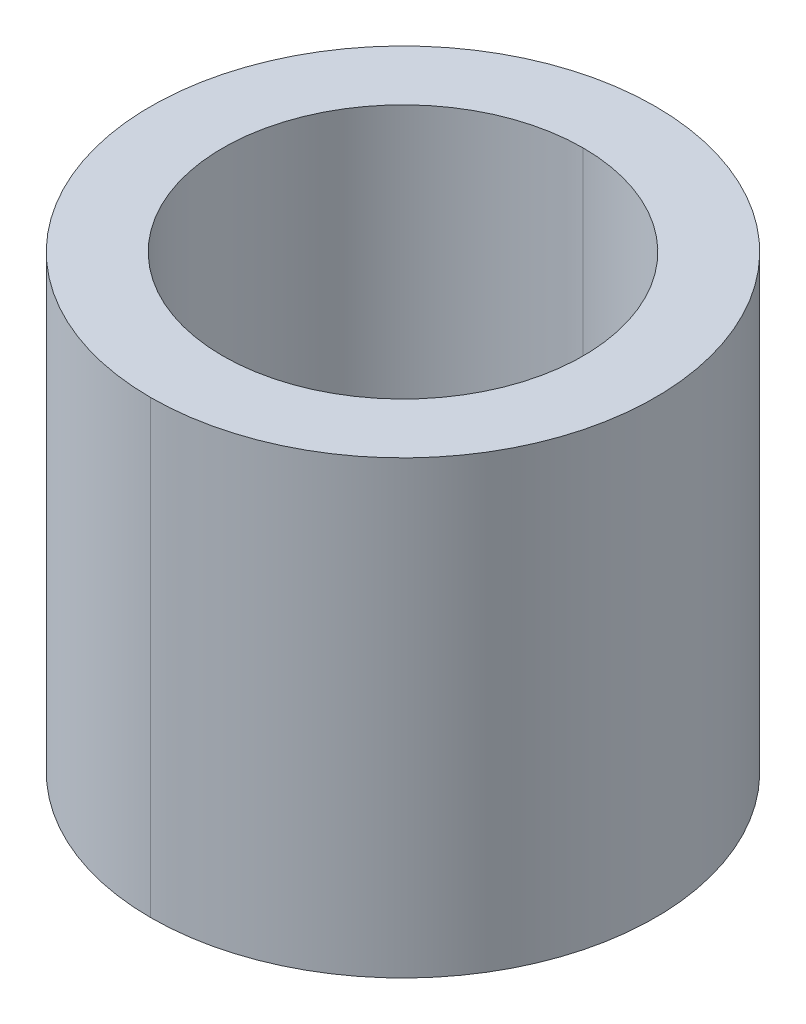
ISO-10303-21;
HEADER;
FILE_DESCRIPTION(('STEP AP214'),'2;1');
FILE_NAME('part.step','',(''),(''),'','','');
FILE_SCHEMA(('AUTOMOTIVE_DESIGN { 1 0 10303 214 1 1 1 1 }'));
ENDSEC;
DATA;
#1=APPLICATION_CONTEXT('core data for automotive mechanical design processes');
#2=APPLICATION_PROTOCOL_DEFINITION('international standard','automotive_design',2000,#1);
#3=PRODUCT_CONTEXT('',#1,'mechanical');
#4=PRODUCT('Part','Part','',(#3));
#5=PRODUCT_RELATED_PRODUCT_CATEGORY('part','',(#4));
#6=PRODUCT_DEFINITION_FORMATION('','',#4);
#7=PRODUCT_DEFINITION_CONTEXT('part definition',#1,'design');
#8=PRODUCT_DEFINITION('design','',#6,#7);
#9=PRODUCT_DEFINITION_SHAPE('','',#8);
#10=(LENGTH_UNIT() NAMED_UNIT(*) SI_UNIT(.MILLI.,.METRE.));
#11=(NAMED_UNIT(*) PLANE_ANGLE_UNIT() SI_UNIT($,.RADIAN.));
#12=(NAMED_UNIT(*) SI_UNIT($,.STERADIAN.) SOLID_ANGLE_UNIT());
#13=UNCERTAINTY_MEASURE_WITH_UNIT(LENGTH_MEASURE(1.E-05),#10,'distance_accuracy_value','');
#14=(GEOMETRIC_REPRESENTATION_CONTEXT(3) GLOBAL_UNCERTAINTY_ASSIGNED_CONTEXT((#13)) GLOBAL_UNIT_ASSIGNED_CONTEXT((#10,
#11,#12)) REPRESENTATION_CONTEXT('',''));
#15=CARTESIAN_POINT('',(0.,0.,0.));
#16=DIRECTION('',(0.,0.,1.));
#17=DIRECTION('',(1.,0.,0.));
#18=AXIS2_PLACEMENT_3D('',#15,#16,#17);
#19=CARTESIAN_POINT('',(0.,5.,0.));
#20=DIRECTION('',(0.,-1.,0.));
#21=DIRECTION('',(0.,0.,-1.));
#22=AXIS2_PLACEMENT_3D('',#19,#20,#21);
#23=CYLINDRICAL_SURFACE('',#22,2.);
#24=DIRECTION('',(0.,-1.,0.));
#25=VECTOR('',#24,1.);
#26=CARTESIAN_POINT('',(0.,5.,2.));
#27=LINE('',#26,#25);
#28=CARTESIAN_POINT('',(0.,5.,2.));
#29=VERTEX_POINT('',#28);
#30=CARTESIAN_POINT('',(0.,0.,2.));
#31=VERTEX_POINT('',#30);
#32=EDGE_CURVE('E104',#29,#31,#27,.T.);
#33=ORIENTED_EDGE('',*,*,#32,.F.);
#34=CARTESIAN_POINT('',(0.,5.,0.));
#35=DIRECTION('',(0.,1.,0.));
#36=DIRECTION('',(0.,0.,1.));
#37=AXIS2_PLACEMENT_3D('',#34,#35,#36);
#38=CIRCLE('',#37,2.);
#39=CARTESIAN_POINT('',(0.,5.,-2.));
#40=VERTEX_POINT('',#39);
#41=EDGE_CURVE('E72',#29,#40,#38,.T.);
#42=ORIENTED_EDGE('',*,*,#41,.T.);
#43=DIRECTION('',(0.,-1.,0.));
#44=VECTOR('',#43,1.);
#45=CARTESIAN_POINT('',(0.,5.,-2.));
#46=LINE('',#45,#44);
#47=CARTESIAN_POINT('',(0.,0.,-2.));
#48=VERTEX_POINT('',#47);
#49=EDGE_CURVE('E84',#40,#48,#46,.T.);
#50=ORIENTED_EDGE('',*,*,#49,.T.);
#51=CARTESIAN_POINT('',(0.,0.,0.));
#52=DIRECTION('',(0.,1.,0.));
#53=DIRECTION('',(0.,0.,1.));
#54=AXIS2_PLACEMENT_3D('',#51,#52,#53);
#55=CIRCLE('',#54,2.);
#56=EDGE_CURVE('E11',#31,#48,#55,.T.);
#57=ORIENTED_EDGE('',*,*,#56,.F.);
#58=EDGE_LOOP('',(#33,#42,#50,#57));
#59=FACE_BOUND('',#58,.T.);
#60=ADVANCED_FACE('F17',(#59),#23,.F.);
#61=CARTESIAN_POINT('',(0.,5.,0.));
#62=DIRECTION('',(0.,-1.,0.));
#63=DIRECTION('',(0.,0.,-1.));
#64=AXIS2_PLACEMENT_3D('',#61,#62,#63);
#65=CYLINDRICAL_SURFACE('',#64,2.8);
#66=DIRECTION('',(0.,-1.,0.));
#67=VECTOR('',#66,1.);
#68=CARTESIAN_POINT('',(0.,5.,2.8));
#69=LINE('',#68,#67);
#70=CARTESIAN_POINT('',(0.,5.,2.8));
#71=VERTEX_POINT('',#70);
#72=CARTESIAN_POINT('',(0.,0.,2.8));
#73=VERTEX_POINT('',#72);
#74=EDGE_CURVE('E75',#71,#73,#69,.T.);
#75=ORIENTED_EDGE('',*,*,#74,.F.);
#76=CARTESIAN_POINT('',(0.,5.,0.));
#77=DIRECTION('',(0.,1.,0.));
#78=DIRECTION('',(0.,0.,1.));
#79=AXIS2_PLACEMENT_3D('',#76,#77,#78);
#80=CIRCLE('',#79,2.8);
#81=CARTESIAN_POINT('',(0.,5.,-2.8));
#82=VERTEX_POINT('',#81);
#83=EDGE_CURVE('E66',#82,#71,#80,.T.);
#84=ORIENTED_EDGE('',*,*,#83,.F.);
#85=DIRECTION('',(0.,-1.,0.));
#86=VECTOR('',#85,1.);
#87=CARTESIAN_POINT('',(0.,5.,-2.8));
#88=LINE('',#87,#86);
#89=CARTESIAN_POINT('',(0.,0.,-2.8));
#90=VERTEX_POINT('',#89);
#91=EDGE_CURVE('E73',#82,#90,#88,.T.);
#92=ORIENTED_EDGE('',*,*,#91,.T.);
#93=CARTESIAN_POINT('',(0.,0.,0.));
#94=DIRECTION('',(0.,1.,0.));
#95=DIRECTION('',(0.,0.,1.));
#96=AXIS2_PLACEMENT_3D('',#93,#94,#95);
#97=CIRCLE('',#96,2.8);
#98=EDGE_CURVE('E20',#90,#73,#97,.T.);
#99=ORIENTED_EDGE('',*,*,#98,.T.);
#100=EDGE_LOOP('',(#75,#84,#92,#99));
#101=FACE_BOUND('',#100,.T.);
#102=ADVANCED_FACE('F76',(#101),#65,.T.);
#103=CARTESIAN_POINT('',(0.,0.,0.));
#104=DIRECTION('',(0.,1.,0.));
#105=DIRECTION('',(1.,0.,0.));
#106=AXIS2_PLACEMENT_3D('',#103,#104,#105);
#107=PLANE('',#106);
#108=CARTESIAN_POINT('',(0.,0.,0.));
#109=DIRECTION('',(0.,1.,0.));
#110=DIRECTION('',(0.,0.,1.));
#111=AXIS2_PLACEMENT_3D('',#108,#109,#110);
#112=CIRCLE('',#111,2.);
#113=EDGE_CURVE('E90',#48,#31,#112,.T.);
#114=ORIENTED_EDGE('',*,*,#113,.T.);
#115=ORIENTED_EDGE('',*,*,#56,.T.);
#116=EDGE_LOOP('',(#114,#115));
#117=FACE_BOUND('',#116,.T.);
#118=ORIENTED_EDGE('',*,*,#98,.F.);
#119=CARTESIAN_POINT('',(0.,0.,0.));
#120=DIRECTION('',(0.,1.,0.));
#121=DIRECTION('',(0.,0.,1.));
#122=AXIS2_PLACEMENT_3D('',#119,#120,#121);
#123=CIRCLE('',#122,2.8);
#124=EDGE_CURVE('E80',#73,#90,#123,.T.);
#125=ORIENTED_EDGE('',*,*,#124,.F.);
#126=EDGE_LOOP('',(#118,#125));
#127=FACE_BOUND('',#126,.T.);
#128=ADVANCED_FACE('F166',(#117,#127),#107,.F.);
#129=CARTESIAN_POINT('',(0.,5.,0.));
#130=DIRECTION('',(0.,1.,0.));
#131=DIRECTION('',(1.,0.,0.));
#132=AXIS2_PLACEMENT_3D('',#129,#130,#131);
#133=PLANE('',#132);
#134=CARTESIAN_POINT('',(0.,5.,0.));
#135=DIRECTION('',(0.,1.,0.));
#136=DIRECTION('',(0.,0.,1.));
#137=AXIS2_PLACEMENT_3D('',#134,#135,#136);
#138=CIRCLE('',#137,2.);
#139=EDGE_CURVE('E111',#40,#29,#138,.T.);
#140=ORIENTED_EDGE('',*,*,#139,.F.);
#141=ORIENTED_EDGE('',*,*,#41,.F.);
#142=EDGE_LOOP('',(#140,#141));
#143=FACE_BOUND('',#142,.T.);
#144=ORIENTED_EDGE('',*,*,#83,.T.);
#145=CARTESIAN_POINT('',(0.,5.,0.));
#146=DIRECTION('',(0.,1.,0.));
#147=DIRECTION('',(0.,0.,1.));
#148=AXIS2_PLACEMENT_3D('',#145,#146,#147);
#149=CIRCLE('',#148,2.8);
#150=EDGE_CURVE('E69',#71,#82,#149,.T.);
#151=ORIENTED_EDGE('',*,*,#150,.T.);
#152=EDGE_LOOP('',(#144,#151));
#153=FACE_BOUND('',#152,.T.);
#154=ADVANCED_FACE('F67',(#143,#153),#133,.T.);
#155=CARTESIAN_POINT('',(0.,5.,0.));
#156=DIRECTION('',(0.,-1.,0.));
#157=DIRECTION('',(0.,0.,-1.));
#158=AXIS2_PLACEMENT_3D('',#155,#156,#157);
#159=CYLINDRICAL_SURFACE('',#158,2.8);
#160=ORIENTED_EDGE('',*,*,#150,.F.);
#161=ORIENTED_EDGE('',*,*,#74,.T.);
#162=ORIENTED_EDGE('',*,*,#124,.T.);
#163=ORIENTED_EDGE('',*,*,#91,.F.);
#164=EDGE_LOOP('',(#160,#161,#162,#163));
#165=FACE_BOUND('',#164,.T.);
#166=ADVANCED_FACE('F82',(#165),#159,.T.);
#167=CARTESIAN_POINT('',(0.,5.,0.));
#168=DIRECTION('',(0.,-1.,0.));
#169=DIRECTION('',(0.,0.,-1.));
#170=AXIS2_PLACEMENT_3D('',#167,#168,#169);
#171=CYLINDRICAL_SURFACE('',#170,2.);
#172=ORIENTED_EDGE('',*,*,#139,.T.);
#173=ORIENTED_EDGE('',*,*,#32,.T.);
#174=ORIENTED_EDGE('',*,*,#113,.F.);
#175=ORIENTED_EDGE('',*,*,#49,.F.);
#176=EDGE_LOOP('',(#172,#173,#174,#175));
#177=FACE_BOUND('',#176,.T.);
#178=ADVANCED_FACE('F142',(#177),#171,.F.);
#179=CLOSED_SHELL('',(#60,#102,#128,#154,#166,#178));
#180=MANIFOLD_SOLID_BREP('B1',#179);
#181=ADVANCED_BREP_SHAPE_REPRESENTATION('',(#18,#180),#14);
#182=SHAPE_DEFINITION_REPRESENTATION(#9,#181);
ENDSEC;
END-ISO-10303-21;
